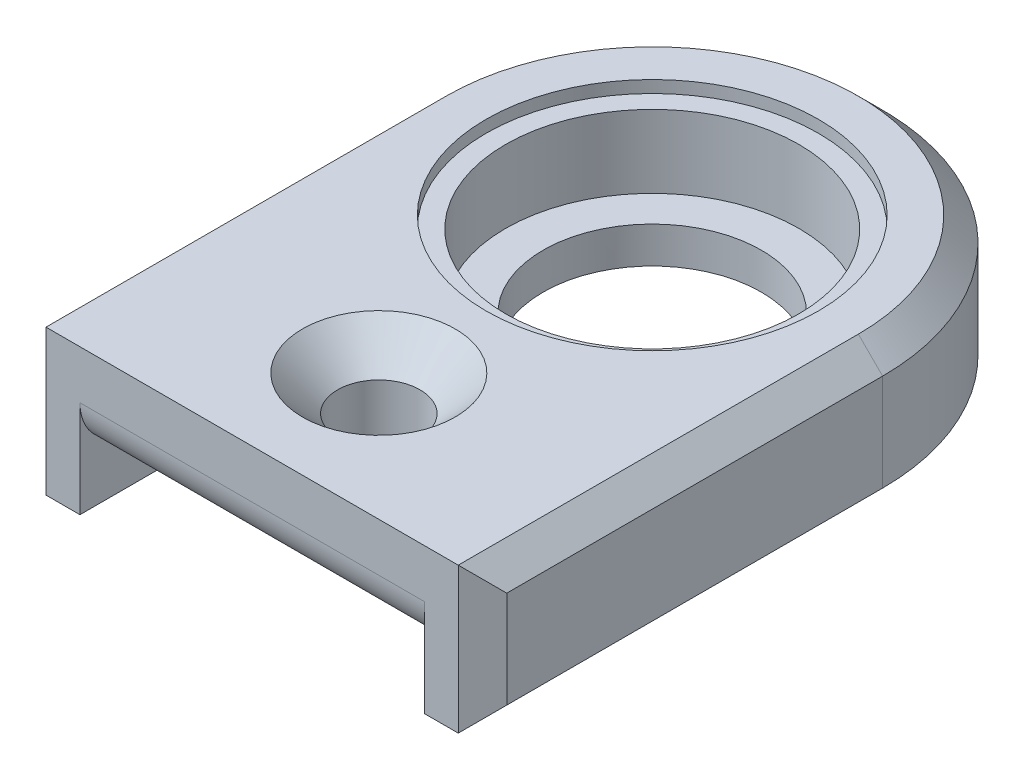
ISO-10303-21;
HEADER;
FILE_DESCRIPTION(('STEP AP214'),'2;1');
FILE_NAME('part.step','',(''),(''),'','','');
FILE_SCHEMA(('AUTOMOTIVE_DESIGN { 1 0 10303 214 1 1 1 1 }'));
ENDSEC;
DATA;
#1=APPLICATION_CONTEXT('core data for automotive mechanical design processes');
#2=APPLICATION_PROTOCOL_DEFINITION('international standard','automotive_design',2000,#1);
#3=PRODUCT_CONTEXT('',#1,'mechanical');
#4=PRODUCT('Part','Part','',(#3));
#5=PRODUCT_RELATED_PRODUCT_CATEGORY('part','',(#4));
#6=PRODUCT_DEFINITION_FORMATION('','',#4);
#7=PRODUCT_DEFINITION_CONTEXT('part definition',#1,'design');
#8=PRODUCT_DEFINITION('design','',#6,#7);
#9=PRODUCT_DEFINITION_SHAPE('','',#8);
#10=(LENGTH_UNIT() NAMED_UNIT(*) SI_UNIT(.MILLI.,.METRE.));
#11=(NAMED_UNIT(*) PLANE_ANGLE_UNIT() SI_UNIT($,.RADIAN.));
#12=(NAMED_UNIT(*) SI_UNIT($,.STERADIAN.) SOLID_ANGLE_UNIT());
#13=UNCERTAINTY_MEASURE_WITH_UNIT(LENGTH_MEASURE(1.E-05),#10,'distance_accuracy_value','');
#14=(GEOMETRIC_REPRESENTATION_CONTEXT(3) GLOBAL_UNCERTAINTY_ASSIGNED_CONTEXT((#13)) GLOBAL_UNIT_ASSIGNED_CONTEXT((#10,
#11,#12)) REPRESENTATION_CONTEXT('',''));
#15=CARTESIAN_POINT('',(0.,0.,0.));
#16=DIRECTION('',(0.,0.,1.));
#17=DIRECTION('',(1.,0.,0.));
#18=AXIS2_PLACEMENT_3D('',#15,#16,#17);
#19=CARTESIAN_POINT('',(0.,6.,0.));
#20=DIRECTION('',(0.,-1.,0.));
#21=DIRECTION('',(0.,0.,-1.));
#22=AXIS2_PLACEMENT_3D('',#19,#20,#21);
#23=PLANE('',#22);
#24=CARTESIAN_POINT('',(0.,6.,0.));
#25=DIRECTION('',(0.,1.,0.));
#26=DIRECTION('',(0.,0.,1.));
#27=AXIS2_PLACEMENT_3D('',#24,#25,#26);
#28=CIRCLE('',#27,6.85);
#29=CARTESIAN_POINT('',(0.,6.,6.85));
#30=VERTEX_POINT('',#29);
#31=EDGE_CURVE('E265',#30,#30,#28,.T.);
#32=ORIENTED_EDGE('',*,*,#31,.F.);
#33=EDGE_LOOP('',(#32));
#34=FACE_BOUND('',#33,.T.);
#35=DIRECTION('',(1.,0.,0.));
#36=VECTOR('',#35,1.);
#37=CARTESIAN_POINT('',(9.5,6.,16.5));
#38=LINE('',#37,#36);
#39=CARTESIAN_POINT('',(-8.49999999999995,6.,16.5));
#40=VERTEX_POINT('',#39);
#41=CARTESIAN_POINT('',(8.49999999999995,6.,16.5));
#42=VERTEX_POINT('',#41);
#43=EDGE_CURVE('E165',#40,#42,#38,.T.);
#44=ORIENTED_EDGE('',*,*,#43,.T.);
#45=DIRECTION('',(0.,0.,-1.));
#46=VECTOR('',#45,1.);
#47=CARTESIAN_POINT('',(8.49999999999995,6.,0.));
#48=LINE('',#47,#46);
#49=CARTESIAN_POINT('',(8.49999999999995,6.,0.));
#50=VERTEX_POINT('',#49);
#51=EDGE_CURVE('E211',#42,#50,#48,.T.);
#52=ORIENTED_EDGE('',*,*,#51,.T.);
#53=CARTESIAN_POINT('',(0.,6.,0.));
#54=DIRECTION('',(0.,-1.,0.));
#55=DIRECTION('',(0.,0.,-1.));
#56=AXIS2_PLACEMENT_3D('',#53,#54,#55);
#57=CIRCLE('',#56,8.49999999999995);
#58=CARTESIAN_POINT('',(-8.49999999999995,6.,0.));
#59=VERTEX_POINT('',#58);
#60=EDGE_CURVE('E209',#50,#59,#57,.F.);
#61=ORIENTED_EDGE('',*,*,#60,.T.);
#62=DIRECTION('',(0.,0.,1.));
#63=VECTOR('',#62,1.);
#64=CARTESIAN_POINT('',(-8.49999999999995,6.,0.));
#65=LINE('',#64,#63);
#66=EDGE_CURVE('E207',#59,#40,#65,.T.);
#67=ORIENTED_EDGE('',*,*,#66,.T.);
#68=EDGE_LOOP('',(#44,#52,#61,#67));
#69=FACE_BOUND('',#68,.T.);
#70=CARTESIAN_POINT('',(0.,6.,11.275));
#71=DIRECTION('',(0.,1.,0.));
#72=DIRECTION('',(0.,0.,1.));
#73=AXIS2_PLACEMENT_3D('',#70,#71,#72);
#74=CIRCLE('',#73,3.15);
#75=CARTESIAN_POINT('',(0.,6.,14.425));
#76=VERTEX_POINT('',#75);
#77=EDGE_CURVE('E241',#76,#76,#74,.T.);
#78=ORIENTED_EDGE('',*,*,#77,.F.);
#79=EDGE_LOOP('',(#78));
#80=FACE_BOUND('',#79,.T.);
#81=ADVANCED_FACE('F34',(#34,#69,#80),#23,.F.);
#82=CARTESIAN_POINT('',(0.,2.,0.));
#83=DIRECTION('',(0.,1.,0.));
#84=DIRECTION('',(0.,0.,1.));
#85=AXIS2_PLACEMENT_3D('',#82,#83,#84);
#86=PLANE('',#85);
#87=CARTESIAN_POINT('',(0.,2.,11.275));
#88=DIRECTION('',(0.,1.,0.));
#89=DIRECTION('',(0.,0.,1.));
#90=AXIS2_PLACEMENT_3D('',#87,#88,#89);
#91=CIRCLE('',#90,1.7);
#92=CARTESIAN_POINT('',(0.,2.,12.975));
#93=VERTEX_POINT('',#92);
#94=EDGE_CURVE('E251',#93,#93,#91,.T.);
#95=ORIENTED_EDGE('',*,*,#94,.T.);
#96=EDGE_LOOP('',(#95));
#97=FACE_BOUND('',#96,.T.);
#98=DIRECTION('',(0.,0.,-1.));
#99=VECTOR('',#98,1.);
#100=CARTESIAN_POINT('',(7.1,2.,16.5));
#101=LINE('',#100,#99);
#102=CARTESIAN_POINT('',(7.1,2.,14.5));
#103=VERTEX_POINT('',#102);
#104=CARTESIAN_POINT('',(7.1,2.,0.));
#105=VERTEX_POINT('',#104);
#106=EDGE_CURVE('E139',#103,#105,#101,.T.);
#107=ORIENTED_EDGE('',*,*,#106,.F.);
#108=DIRECTION('',(1.,0.,0.));
#109=VECTOR('',#108,1.);
#110=CARTESIAN_POINT('',(0.,2.,14.5));
#111=LINE('',#110,#109);
#112=CARTESIAN_POINT('',(-7.1,2.,14.5));
#113=VERTEX_POINT('',#112);
#114=EDGE_CURVE('E134',#103,#113,#111,.F.);
#115=ORIENTED_EDGE('',*,*,#114,.T.);
#116=DIRECTION('',(0.,0.,1.));
#117=VECTOR('',#116,1.);
#118=CARTESIAN_POINT('',(-7.1,2.,0.));
#119=LINE('',#118,#117);
#120=CARTESIAN_POINT('',(-7.1,2.,0.));
#121=VERTEX_POINT('',#120);
#122=EDGE_CURVE('E127',#121,#113,#119,.T.);
#123=ORIENTED_EDGE('',*,*,#122,.F.);
#124=CARTESIAN_POINT('',(0.,2.,0.));
#125=DIRECTION('',(0.,1.,0.));
#126=DIRECTION('',(0.,0.,1.));
#127=AXIS2_PLACEMENT_3D('',#124,#125,#126);
#128=CIRCLE('',#127,7.1);
#129=EDGE_CURVE('E132',#105,#121,#128,.T.);
#130=ORIENTED_EDGE('',*,*,#129,.F.);
#131=EDGE_LOOP('',(#107,#115,#123,#130));
#132=FACE_BOUND('',#131,.T.);
#133=CARTESIAN_POINT('',(0.,2.,0.));
#134=DIRECTION('',(0.,1.,0.));
#135=DIRECTION('',(0.,0.,1.));
#136=AXIS2_PLACEMENT_3D('',#133,#134,#135);
#137=CIRCLE('',#136,5.);
#138=CARTESIAN_POINT('',(0.,2.,5.));
#139=VERTEX_POINT('',#138);
#140=EDGE_CURVE('E186',#139,#139,#137,.F.);
#141=ORIENTED_EDGE('',*,*,#140,.F.);
#142=EDGE_LOOP('',(#141));
#143=FACE_BOUND('',#142,.T.);
#144=ADVANCED_FACE('F130',(#97,#132,#143),#86,.F.);
#145=CARTESIAN_POINT('',(9.5,6.,16.5));
#146=DIRECTION('',(0.,0.,-1.));
#147=DIRECTION('',(-1.,0.,0.));
#148=AXIS2_PLACEMENT_3D('',#145,#146,#147);
#149=PLANE('',#148);
#150=DIRECTION('',(1.,0.,0.));
#151=VECTOR('',#150,1.);
#152=CARTESIAN_POINT('',(9.5,0.,16.5));
#153=LINE('',#152,#151);
#154=CARTESIAN_POINT('',(7.1,0.,16.5));
#155=VERTEX_POINT('',#154);
#156=CARTESIAN_POINT('',(8.49999999999995,0.,16.5));
#157=VERTEX_POINT('',#156);
#158=EDGE_CURVE('E155',#155,#157,#153,.T.);
#159=ORIENTED_EDGE('',*,*,#158,.T.);
#160=DIRECTION('',(0.,1.,0.));
#161=VECTOR('',#160,1.);
#162=CARTESIAN_POINT('',(8.49999999999999,6.,16.5));
#163=LINE('',#162,#161);
#164=EDGE_CURVE('E198',#157,#42,#163,.T.);
#165=ORIENTED_EDGE('',*,*,#164,.T.);
#166=ORIENTED_EDGE('',*,*,#43,.F.);
#167=DIRECTION('',(0.,-1.,0.));
#168=VECTOR('',#167,1.);
#169=CARTESIAN_POINT('',(-8.49999999999995,6.,16.5));
#170=LINE('',#169,#168);
#171=CARTESIAN_POINT('',(-8.49999999999995,0.,16.5));
#172=VERTEX_POINT('',#171);
#173=EDGE_CURVE('E196',#40,#172,#170,.T.);
#174=ORIENTED_EDGE('',*,*,#173,.T.);
#175=CARTESIAN_POINT('',(-7.1,0.,16.5));
#176=VERTEX_POINT('',#175);
#177=EDGE_CURVE('E159',#172,#176,#153,.T.);
#178=ORIENTED_EDGE('',*,*,#177,.T.);
#179=DIRECTION('',(0.,-1.,0.));
#180=VECTOR('',#179,1.);
#181=CARTESIAN_POINT('',(-7.1,2.,16.5));
#182=LINE('',#181,#180);
#183=CARTESIAN_POINT('',(-7.1,4.,16.5));
#184=VERTEX_POINT('',#183);
#185=EDGE_CURVE('E156',#184,#176,#182,.T.);
#186=ORIENTED_EDGE('',*,*,#185,.F.);
#187=DIRECTION('',(1.,0.,0.));
#188=VECTOR('',#187,1.);
#189=CARTESIAN_POINT('',(9.5,4.,16.5));
#190=LINE('',#189,#188);
#191=CARTESIAN_POINT('',(7.1,4.,16.5));
#192=VERTEX_POINT('',#191);
#193=EDGE_CURVE('E173',#184,#192,#190,.T.);
#194=ORIENTED_EDGE('',*,*,#193,.T.);
#195=DIRECTION('',(0.,-1.,0.));
#196=VECTOR('',#195,1.);
#197=CARTESIAN_POINT('',(7.1,2.,16.5));
#198=LINE('',#197,#196);
#199=EDGE_CURVE('E161',#192,#155,#198,.T.);
#200=ORIENTED_EDGE('',*,*,#199,.T.);
#201=EDGE_LOOP('',(#159,#165,#166,#174,#178,#186,#194,#200));
#202=FACE_BOUND('',#201,.T.);
#203=ADVANCED_FACE('F281',(#202),#149,.F.);
#204=CARTESIAN_POINT('',(0.,0.,0.));
#205=DIRECTION('',(0.,-1.,0.));
#206=DIRECTION('',(0.,0.,-1.));
#207=AXIS2_PLACEMENT_3D('',#204,#205,#206);
#208=PLANE('',#207);
#209=CARTESIAN_POINT('',(0.,0.,0.));
#210=DIRECTION('',(0.,-1.,0.));
#211=DIRECTION('',(0.,0.,-1.));
#212=AXIS2_PLACEMENT_3D('',#209,#210,#211);
#213=CIRCLE('',#212,8.49999999999995);
#214=CARTESIAN_POINT('',(-8.49999999999995,0.,0.));
#215=VERTEX_POINT('',#214);
#216=CARTESIAN_POINT('',(8.49999999999995,0.,0.));
#217=VERTEX_POINT('',#216);
#218=EDGE_CURVE('E203',#215,#217,#213,.T.);
#219=ORIENTED_EDGE('',*,*,#218,.T.);
#220=DIRECTION('',(0.,0.,1.));
#221=VECTOR('',#220,1.);
#222=CARTESIAN_POINT('',(8.49999999999995,0.,16.5));
#223=LINE('',#222,#221);
#224=EDGE_CURVE('E205',#217,#157,#223,.T.);
#225=ORIENTED_EDGE('',*,*,#224,.T.);
#226=ORIENTED_EDGE('',*,*,#158,.F.);
#227=DIRECTION('',(0.,0.,-1.));
#228=VECTOR('',#227,1.);
#229=CARTESIAN_POINT('',(7.1,0.,16.5));
#230=LINE('',#229,#228);
#231=CARTESIAN_POINT('',(7.1,0.,0.));
#232=VERTEX_POINT('',#231);
#233=EDGE_CURVE('E149',#155,#232,#230,.T.);
#234=ORIENTED_EDGE('',*,*,#233,.T.);
#235=CARTESIAN_POINT('',(0.,0.,0.));
#236=DIRECTION('',(0.,1.,0.));
#237=DIRECTION('',(0.,0.,1.));
#238=AXIS2_PLACEMENT_3D('',#235,#236,#237);
#239=CIRCLE('',#238,7.1);
#240=CARTESIAN_POINT('',(-7.1,0.,0.));
#241=VERTEX_POINT('',#240);
#242=EDGE_CURVE('E271',#232,#241,#239,.T.);
#243=ORIENTED_EDGE('',*,*,#242,.T.);
#244=DIRECTION('',(0.,0.,1.));
#245=VECTOR('',#244,1.);
#246=CARTESIAN_POINT('',(-7.1,0.,0.));
#247=LINE('',#246,#245);
#248=EDGE_CURVE('E154',#241,#176,#247,.T.);
#249=ORIENTED_EDGE('',*,*,#248,.T.);
#250=ORIENTED_EDGE('',*,*,#177,.F.);
#251=DIRECTION('',(0.,0.,-1.));
#252=VECTOR('',#251,1.);
#253=CARTESIAN_POINT('',(-8.49999999999995,0.,0.));
#254=LINE('',#253,#252);
#255=EDGE_CURVE('E201',#172,#215,#254,.T.);
#256=ORIENTED_EDGE('',*,*,#255,.T.);
#257=EDGE_LOOP('',(#219,#225,#226,#234,#243,#249,#250,#256));
#258=FACE_BOUND('',#257,.T.);
#259=ADVANCED_FACE('F287',(#258),#208,.T.);
#260=CARTESIAN_POINT('',(0.,6.,0.));
#261=DIRECTION('',(0.,-1.,0.));
#262=DIRECTION('',(0.,0.,-1.));
#263=AXIS2_PLACEMENT_3D('',#260,#261,#262);
#264=CYLINDRICAL_SURFACE('',#263,9.5);
#265=DIRECTION('',(0.,-1.,0.));
#266=VECTOR('',#265,1.);
#267=CARTESIAN_POINT('',(9.5,6.,0.));
#268=LINE('',#267,#266);
#269=CARTESIAN_POINT('',(9.5,5.,0.));
#270=VERTEX_POINT('',#269);
#271=CARTESIAN_POINT('',(9.5,1.,0.));
#272=VERTEX_POINT('',#271);
#273=EDGE_CURVE('E167',#270,#272,#268,.T.);
#274=ORIENTED_EDGE('',*,*,#273,.T.);
#275=CARTESIAN_POINT('',(0.,1.,0.));
#276=DIRECTION('',(0.,-1.,0.));
#277=DIRECTION('',(0.,0.,-1.));
#278=AXIS2_PLACEMENT_3D('',#275,#276,#277);
#279=CIRCLE('',#278,9.5);
#280=CARTESIAN_POINT('',(-9.5,1.,0.));
#281=VERTEX_POINT('',#280);
#282=EDGE_CURVE('E215',#272,#281,#279,.F.);
#283=ORIENTED_EDGE('',*,*,#282,.T.);
#284=DIRECTION('',(0.,-1.,0.));
#285=VECTOR('',#284,1.);
#286=CARTESIAN_POINT('',(-9.5,6.,0.));
#287=LINE('',#286,#285);
#288=CARTESIAN_POINT('',(-9.5,5.,0.));
#289=VERTEX_POINT('',#288);
#290=EDGE_CURVE('E171',#289,#281,#287,.T.);
#291=ORIENTED_EDGE('',*,*,#290,.F.);
#292=CARTESIAN_POINT('',(0.,5.,0.));
#293=DIRECTION('',(0.,-1.,0.));
#294=DIRECTION('',(0.,0.,-1.));
#295=AXIS2_PLACEMENT_3D('',#292,#293,#294);
#296=CIRCLE('',#295,9.5);
#297=EDGE_CURVE('E213',#289,#270,#296,.T.);
#298=ORIENTED_EDGE('',*,*,#297,.T.);
#299=EDGE_LOOP('',(#274,#283,#291,#298));
#300=FACE_BOUND('',#299,.T.);
#301=ADVANCED_FACE('F315',(#300),#264,.T.);
#302=CARTESIAN_POINT('',(-9.5,6.,16.5));
#303=DIRECTION('',(1.,0.,0.));
#304=DIRECTION('',(0.,0.,-1.));
#305=AXIS2_PLACEMENT_3D('',#302,#303,#304);
#306=PLANE('',#305);
#307=ORIENTED_EDGE('',*,*,#290,.T.);
#308=DIRECTION('',(0.,0.,1.));
#309=VECTOR('',#308,1.);
#310=CARTESIAN_POINT('',(-9.5,1.,16.5));
#311=LINE('',#310,#309);
#312=CARTESIAN_POINT('',(-9.5,1.,15.5));
#313=VERTEX_POINT('',#312);
#314=EDGE_CURVE('E11',#281,#313,#311,.T.);
#315=ORIENTED_EDGE('',*,*,#314,.T.);
#316=DIRECTION('',(0.,1.,0.));
#317=VECTOR('',#316,1.);
#318=CARTESIAN_POINT('',(-9.5,6.,15.5));
#319=LINE('',#318,#317);
#320=CARTESIAN_POINT('',(-9.5,5.,15.5));
#321=VERTEX_POINT('',#320);
#322=EDGE_CURVE('E43',#313,#321,#319,.T.);
#323=ORIENTED_EDGE('',*,*,#322,.T.);
#324=DIRECTION('',(0.,0.,-1.));
#325=VECTOR('',#324,1.);
#326=CARTESIAN_POINT('',(-9.5,5.,16.5));
#327=LINE('',#326,#325);
#328=EDGE_CURVE('E217',#321,#289,#327,.T.);
#329=ORIENTED_EDGE('',*,*,#328,.T.);
#330=EDGE_LOOP('',(#307,#315,#323,#329));
#331=FACE_BOUND('',#330,.T.);
#332=ADVANCED_FACE('F347',(#331),#306,.F.);
#333=CARTESIAN_POINT('',(9.5,6.,0.));
#334=DIRECTION('',(-1.,0.,0.));
#335=DIRECTION('',(0.,0.,1.));
#336=AXIS2_PLACEMENT_3D('',#333,#334,#335);
#337=PLANE('',#336);
#338=DIRECTION('',(0.,-1.,0.));
#339=VECTOR('',#338,1.);
#340=CARTESIAN_POINT('',(9.5,6.,15.5));
#341=LINE('',#340,#339);
#342=CARTESIAN_POINT('',(9.5,5.,15.5));
#343=VERTEX_POINT('',#342);
#344=CARTESIAN_POINT('',(9.5,1.,15.5));
#345=VERTEX_POINT('',#344);
#346=EDGE_CURVE('E191',#343,#345,#341,.T.);
#347=ORIENTED_EDGE('',*,*,#346,.T.);
#348=DIRECTION('',(0.,0.,-1.));
#349=VECTOR('',#348,1.);
#350=CARTESIAN_POINT('',(9.5,1.,0.));
#351=LINE('',#350,#349);
#352=EDGE_CURVE('E194',#345,#272,#351,.T.);
#353=ORIENTED_EDGE('',*,*,#352,.T.);
#354=ORIENTED_EDGE('',*,*,#273,.F.);
#355=DIRECTION('',(0.,0.,1.));
#356=VECTOR('',#355,1.);
#357=CARTESIAN_POINT('',(9.5,5.,0.));
#358=LINE('',#357,#356);
#359=EDGE_CURVE('E189',#270,#343,#358,.T.);
#360=ORIENTED_EDGE('',*,*,#359,.T.);
#361=EDGE_LOOP('',(#347,#353,#354,#360));
#362=FACE_BOUND('',#361,.T.);
#363=ADVANCED_FACE('F318',(#362),#337,.F.);
#364=CARTESIAN_POINT('',(0.,2.,0.));
#365=DIRECTION('',(0.,-1.,0.));
#366=DIRECTION('',(0.,0.,-1.));
#367=AXIS2_PLACEMENT_3D('',#364,#365,#366);
#368=CYLINDRICAL_SURFACE('',#367,7.1);
#369=ORIENTED_EDGE('',*,*,#242,.F.);
#370=DIRECTION('',(0.,-1.,0.));
#371=VECTOR('',#370,1.);
#372=CARTESIAN_POINT('',(7.1,2.,0.));
#373=LINE('',#372,#371);
#374=EDGE_CURVE('E148',#105,#232,#373,.T.);
#375=ORIENTED_EDGE('',*,*,#374,.F.);
#376=ORIENTED_EDGE('',*,*,#129,.T.);
#377=DIRECTION('',(0.,-1.,0.));
#378=VECTOR('',#377,1.);
#379=CARTESIAN_POINT('',(-7.1,2.,0.));
#380=LINE('',#379,#378);
#381=EDGE_CURVE('E145',#121,#241,#380,.T.);
#382=ORIENTED_EDGE('',*,*,#381,.T.);
#383=EDGE_LOOP('',(#369,#375,#376,#382));
#384=FACE_BOUND('',#383,.T.);
#385=ADVANCED_FACE('F144',(#384),#368,.F.);
#386=CARTESIAN_POINT('',(-7.1,2.,0.));
#387=DIRECTION('',(1.,0.,0.));
#388=DIRECTION('',(0.,0.,-1.));
#389=AXIS2_PLACEMENT_3D('',#386,#387,#388);
#390=PLANE('',#389);
#391=ORIENTED_EDGE('',*,*,#248,.F.);
#392=ORIENTED_EDGE('',*,*,#381,.F.);
#393=ORIENTED_EDGE('',*,*,#122,.T.);
#394=CARTESIAN_POINT('',(-7.1,4.,14.5));
#395=DIRECTION('',(1.,0.,0.));
#396=DIRECTION('',(0.,0.,-1.));
#397=AXIS2_PLACEMENT_3D('',#394,#395,#396);
#398=CIRCLE('',#397,2.);
#399=EDGE_CURVE('E184',#113,#184,#398,.F.);
#400=ORIENTED_EDGE('',*,*,#399,.T.);
#401=ORIENTED_EDGE('',*,*,#185,.T.);
#402=EDGE_LOOP('',(#391,#392,#393,#400,#401));
#403=FACE_BOUND('',#402,.T.);
#404=ADVANCED_FACE('F151',(#403),#390,.T.);
#405=CARTESIAN_POINT('',(7.1,2.,16.5));
#406=DIRECTION('',(-1.,0.,0.));
#407=DIRECTION('',(0.,0.,1.));
#408=AXIS2_PLACEMENT_3D('',#405,#406,#407);
#409=PLANE('',#408);
#410=ORIENTED_EDGE('',*,*,#233,.F.);
#411=ORIENTED_EDGE('',*,*,#199,.F.);
#412=CARTESIAN_POINT('',(7.1,4.,14.5));
#413=DIRECTION('',(-1.,0.,0.));
#414=DIRECTION('',(0.,0.,1.));
#415=AXIS2_PLACEMENT_3D('',#412,#413,#414);
#416=CIRCLE('',#415,2.);
#417=EDGE_CURVE('E182',#192,#103,#416,.F.);
#418=ORIENTED_EDGE('',*,*,#417,.T.);
#419=ORIENTED_EDGE('',*,*,#106,.T.);
#420=ORIENTED_EDGE('',*,*,#374,.T.);
#421=EDGE_LOOP('',(#410,#411,#418,#419,#420));
#422=FACE_BOUND('',#421,.T.);
#423=ADVANCED_FACE('F513',(#422),#409,.T.);
#424=CARTESIAN_POINT('',(0.,5.5,0.));
#425=DIRECTION('',(0.,1.,0.));
#426=DIRECTION('',(0.,0.,1.));
#427=AXIS2_PLACEMENT_3D('',#424,#425,#426);
#428=PLANE('',#427);
#429=CARTESIAN_POINT('',(0.,5.5,0.));
#430=DIRECTION('',(0.,1.,0.));
#431=DIRECTION('',(0.,0.,1.));
#432=AXIS2_PLACEMENT_3D('',#429,#430,#431);
#433=CIRCLE('',#432,6.85);
#434=CARTESIAN_POINT('',(0.,5.5,6.85));
#435=VERTEX_POINT('',#434);
#436=EDGE_CURVE('E178',#435,#435,#433,.T.);
#437=ORIENTED_EDGE('',*,*,#436,.T.);
#438=EDGE_LOOP('',(#437));
#439=FACE_BOUND('',#438,.T.);
#440=CARTESIAN_POINT('',(0.,5.5,0.));
#441=DIRECTION('',(0.,1.,0.));
#442=DIRECTION('',(0.,0.,1.));
#443=AXIS2_PLACEMENT_3D('',#440,#441,#442);
#444=CIRCLE('',#443,6.05);
#445=CARTESIAN_POINT('',(0.,5.5,6.05));
#446=VERTEX_POINT('',#445);
#447=EDGE_CURVE('E174',#446,#446,#444,.F.);
#448=ORIENTED_EDGE('',*,*,#447,.T.);
#449=EDGE_LOOP('',(#448));
#450=FACE_BOUND('',#449,.T.);
#451=ADVANCED_FACE('F518',(#439,#450),#428,.T.);
#452=CARTESIAN_POINT('',(0.,5.5,0.));
#453=DIRECTION('',(0.,1.,0.));
#454=DIRECTION('',(0.,0.,1.));
#455=AXIS2_PLACEMENT_3D('',#452,#453,#454);
#456=CYLINDRICAL_SURFACE('',#455,6.85);
#457=ORIENTED_EDGE('',*,*,#436,.F.);
#458=EDGE_LOOP('',(#457));
#459=FACE_BOUND('',#458,.T.);
#460=ORIENTED_EDGE('',*,*,#31,.T.);
#461=EDGE_LOOP('',(#460));
#462=FACE_BOUND('',#461,.T.);
#463=ADVANCED_FACE('F536',(#459,#462),#456,.F.);
#464=CARTESIAN_POINT('',(0.,2.5,0.));
#465=DIRECTION('',(0.,1.,0.));
#466=DIRECTION('',(0.,0.,1.));
#467=AXIS2_PLACEMENT_3D('',#464,#465,#466);
#468=PLANE('',#467);
#469=CARTESIAN_POINT('',(0.,2.5,0.));
#470=DIRECTION('',(0.,1.,0.));
#471=DIRECTION('',(0.,0.,1.));
#472=AXIS2_PLACEMENT_3D('',#469,#470,#471);
#473=CIRCLE('',#472,4.5);
#474=CARTESIAN_POINT('',(0.,2.5,4.5));
#475=VERTEX_POINT('',#474);
#476=EDGE_CURVE('E262',#475,#475,#473,.T.);
#477=ORIENTED_EDGE('',*,*,#476,.F.);
#478=EDGE_LOOP('',(#477));
#479=FACE_BOUND('',#478,.T.);
#480=CARTESIAN_POINT('',(0.,2.5,0.));
#481=DIRECTION('',(0.,1.,0.));
#482=DIRECTION('',(0.,0.,1.));
#483=AXIS2_PLACEMENT_3D('',#480,#481,#482);
#484=CIRCLE('',#483,6.05);
#485=CARTESIAN_POINT('',(0.,2.5,6.05));
#486=VERTEX_POINT('',#485);
#487=EDGE_CURVE('E177',#486,#486,#484,.T.);
#488=ORIENTED_EDGE('',*,*,#487,.T.);
#489=EDGE_LOOP('',(#488));
#490=FACE_BOUND('',#489,.T.);
#491=ADVANCED_FACE('F532',(#479,#490),#468,.T.);
#492=CARTESIAN_POINT('',(0.,2.5,0.));
#493=DIRECTION('',(0.,1.,0.));
#494=DIRECTION('',(0.,0.,1.));
#495=AXIS2_PLACEMENT_3D('',#492,#493,#494);
#496=CYLINDRICAL_SURFACE('',#495,6.05);
#497=ORIENTED_EDGE('',*,*,#487,.F.);
#498=EDGE_LOOP('',(#497));
#499=FACE_BOUND('',#498,.T.);
#500=ORIENTED_EDGE('',*,*,#447,.F.);
#501=EDGE_LOOP('',(#500));
#502=FACE_BOUND('',#501,.T.);
#503=ADVANCED_FACE('F500',(#499,#502),#496,.F.);
#504=CARTESIAN_POINT('',(0.,-0.00100000000000013,0.));
#505=DIRECTION('',(0.,1.,0.));
#506=DIRECTION('',(0.,0.,1.));
#507=AXIS2_PLACEMENT_3D('',#504,#505,#506);
#508=CYLINDRICAL_SURFACE('',#507,4.5);
#509=ORIENTED_EDGE('',*,*,#476,.T.);
#510=EDGE_LOOP('',(#509));
#511=FACE_BOUND('',#510,.T.);
#512=CARTESIAN_POINT('',(0.,1.,0.));
#513=DIRECTION('',(0.,-1.,0.));
#514=DIRECTION('',(0.,0.,-1.));
#515=AXIS2_PLACEMENT_3D('',#512,#513,#514);
#516=CIRCLE('',#515,4.5);
#517=CARTESIAN_POINT('',(0.,1.,-4.5));
#518=VERTEX_POINT('',#517);
#519=EDGE_CURVE('E256',#518,#518,#516,.T.);
#520=ORIENTED_EDGE('',*,*,#519,.T.);
#521=EDGE_LOOP('',(#520));
#522=FACE_BOUND('',#521,.T.);
#523=ADVANCED_FACE('F358',(#511,#522),#508,.F.);
#524=CARTESIAN_POINT('',(9.5,4.,14.5));
#525=DIRECTION('',(1.,0.,0.));
#526=DIRECTION('',(0.,0.,-1.));
#527=AXIS2_PLACEMENT_3D('',#524,#525,#526);
#528=CYLINDRICAL_SURFACE('',#527,2.);
#529=ORIENTED_EDGE('',*,*,#399,.F.);
#530=ORIENTED_EDGE('',*,*,#114,.F.);
#531=ORIENTED_EDGE('',*,*,#417,.F.);
#532=ORIENTED_EDGE('',*,*,#193,.F.);
#533=EDGE_LOOP('',(#529,#530,#531,#532));
#534=FACE_BOUND('',#533,.T.);
#535=ADVANCED_FACE('F354',(#534),#528,.T.);
#536=CARTESIAN_POINT('',(0.,1.,0.));
#537=DIRECTION('',(0.,-1.,0.));
#538=DIRECTION('',(0.,0.,-1.));
#539=AXIS2_PLACEMENT_3D('',#536,#537,#538);
#540=PLANE('',#539);
#541=CARTESIAN_POINT('',(0.,1.,0.));
#542=DIRECTION('',(0.,-1.,0.));
#543=DIRECTION('',(0.,0.,-1.));
#544=AXIS2_PLACEMENT_3D('',#541,#542,#543);
#545=CIRCLE('',#544,5.);
#546=CARTESIAN_POINT('',(0.,1.,-5.));
#547=VERTEX_POINT('',#546);
#548=EDGE_CURVE('E259',#547,#547,#545,.T.);
#549=ORIENTED_EDGE('',*,*,#548,.T.);
#550=EDGE_LOOP('',(#549));
#551=FACE_BOUND('',#550,.T.);
#552=ORIENTED_EDGE('',*,*,#519,.F.);
#553=EDGE_LOOP('',(#552));
#554=FACE_BOUND('',#553,.T.);
#555=ADVANCED_FACE('F357',(#551,#554),#540,.T.);
#556=CARTESIAN_POINT('',(0.,1.,0.));
#557=DIRECTION('',(0.,1.,0.));
#558=DIRECTION('',(0.,0.,1.));
#559=AXIS2_PLACEMENT_3D('',#556,#557,#558);
#560=CYLINDRICAL_SURFACE('',#559,5.);
#561=ORIENTED_EDGE('',*,*,#548,.F.);
#562=EDGE_LOOP('',(#561));
#563=FACE_BOUND('',#562,.T.);
#564=ORIENTED_EDGE('',*,*,#140,.T.);
#565=EDGE_LOOP('',(#564));
#566=FACE_BOUND('',#565,.T.);
#567=ADVANCED_FACE('F466',(#563,#566),#560,.T.);
#568=CARTESIAN_POINT('',(0.,6.,11.275));
#569=DIRECTION('',(0.,1.,0.));
#570=DIRECTION('',(0.,0.,1.));
#571=AXIS2_PLACEMENT_3D('',#568,#569,#570);
#572=CYLINDRICAL_SURFACE('',#571,1.7);
#573=ORIENTED_EDGE('',*,*,#94,.F.);
#574=EDGE_LOOP('',(#573));
#575=FACE_BOUND('',#574,.T.);
#576=CARTESIAN_POINT('',(0.,4.55,11.275));
#577=DIRECTION('',(0.,1.,0.));
#578=DIRECTION('',(0.,0.,1.));
#579=AXIS2_PLACEMENT_3D('',#576,#577,#578);
#580=CIRCLE('',#579,1.7);
#581=CARTESIAN_POINT('',(0.,4.55,12.975));
#582=VERTEX_POINT('',#581);
#583=EDGE_CURVE('E246',#582,#582,#580,.T.);
#584=ORIENTED_EDGE('',*,*,#583,.T.);
#585=EDGE_LOOP('',(#584));
#586=FACE_BOUND('',#585,.T.);
#587=ADVANCED_FACE('F457',(#575,#586),#572,.F.);
#588=CARTESIAN_POINT('',(0.,6.,11.275));
#589=DIRECTION('',(0.,1.,0.));
#590=DIRECTION('',(0.,0.,1.));
#591=AXIS2_PLACEMENT_3D('',#588,#589,#590);
#592=CONICAL_SURFACE('',#591,3.15,0.785398163397449);
#593=ORIENTED_EDGE('',*,*,#583,.F.);
#594=EDGE_LOOP('',(#593));
#595=FACE_BOUND('',#594,.T.);
#596=ORIENTED_EDGE('',*,*,#77,.T.);
#597=EDGE_LOOP('',(#596));
#598=FACE_BOUND('',#597,.T.);
#599=ADVANCED_FACE('F410',(#595,#598),#592,.F.);
#600=CARTESIAN_POINT('',(-8.49999999999995,6.,16.5));
#601=DIRECTION('',(0.70710678118653,0.,-0.707106781186565));
#602=DIRECTION('',(0.,-1.,0.));
#603=AXIS2_PLACEMENT_3D('',#600,#601,#602);
#604=PLANE('',#603);
#605=DIRECTION('',(-0.577350269189644,0.577350269189616,-0.577350269189616));
#606=VECTOR('',#605,1.);
#607=CARTESIAN_POINT('',(-10.5,1.99999999999993,14.5000000000001));
#608=LINE('',#607,#606);
#609=EDGE_CURVE('E235',#172,#313,#608,.T.);
#610=ORIENTED_EDGE('',*,*,#609,.F.);
#611=ORIENTED_EDGE('',*,*,#173,.F.);
#612=DIRECTION('',(0.577350269189644,0.577350269189616,0.577350269189616));
#613=VECTOR('',#612,1.);
#614=CARTESIAN_POINT('',(-14.,0.500000000000177,11.0000000000002));
#615=LINE('',#614,#613);
#616=EDGE_CURVE('E38',#321,#40,#615,.T.);
#617=ORIENTED_EDGE('',*,*,#616,.F.);
#618=ORIENTED_EDGE('',*,*,#322,.F.);
#619=EDGE_LOOP('',(#610,#611,#617,#618));
#620=FACE_BOUND('',#619,.T.);
#621=ADVANCED_FACE('F36',(#620),#604,.F.);
#622=CARTESIAN_POINT('',(-8.49999999999995,6.,0.));
#623=DIRECTION('',(0.70710678118653,-0.707106781186565,0.));
#624=DIRECTION('',(0.,0.,1.));
#625=AXIS2_PLACEMENT_3D('',#622,#623,#624);
#626=PLANE('',#625);
#627=ORIENTED_EDGE('',*,*,#616,.T.);
#628=ORIENTED_EDGE('',*,*,#66,.F.);
#629=DIRECTION('',(0.707106781186565,0.70710678118653,0.));
#630=VECTOR('',#629,1.);
#631=CARTESIAN_POINT('',(-9.5,5.,0.));
#632=LINE('',#631,#630);
#633=EDGE_CURVE('E233',#289,#59,#632,.T.);
#634=ORIENTED_EDGE('',*,*,#633,.F.);
#635=ORIENTED_EDGE('',*,*,#328,.F.);
#636=EDGE_LOOP('',(#627,#628,#634,#635));
#637=FACE_BOUND('',#636,.T.);
#638=ADVANCED_FACE('F306',(#637),#626,.F.);
#639=CARTESIAN_POINT('',(-9.5,1.,16.5));
#640=DIRECTION('',(-0.70710678118653,-0.707106781186565,0.));
#641=DIRECTION('',(0.,0.,-1.));
#642=AXIS2_PLACEMENT_3D('',#639,#640,#641);
#643=PLANE('',#642);
#644=ORIENTED_EDGE('',*,*,#609,.T.);
#645=ORIENTED_EDGE('',*,*,#314,.F.);
#646=DIRECTION('',(-0.707106781186565,0.70710678118653,0.));
#647=VECTOR('',#646,1.);
#648=CARTESIAN_POINT('',(-8.49999999999995,0.,0.));
#649=LINE('',#648,#647);
#650=EDGE_CURVE('E230',#215,#281,#649,.T.);
#651=ORIENTED_EDGE('',*,*,#650,.F.);
#652=ORIENTED_EDGE('',*,*,#255,.F.);
#653=EDGE_LOOP('',(#644,#645,#651,#652));
#654=FACE_BOUND('',#653,.T.);
#655=ADVANCED_FACE('F386',(#654),#643,.T.);
#656=CARTESIAN_POINT('',(0.,6.,0.));
#657=DIRECTION('',(0.,-1.,0.));
#658=DIRECTION('',(0.,0.,-1.));
#659=AXIS2_PLACEMENT_3D('',#656,#657,#658);
#660=CONICAL_SURFACE('',#659,8.49999999999995,0.785398163397473);
#661=ORIENTED_EDGE('',*,*,#633,.T.);
#662=ORIENTED_EDGE('',*,*,#60,.F.);
#663=DIRECTION('',(-0.707106781186565,0.70710678118653,0.));
#664=VECTOR('',#663,1.);
#665=CARTESIAN_POINT('',(9.5,5.,0.));
#666=LINE('',#665,#664);
#667=EDGE_CURVE('E227',#270,#50,#666,.T.);
#668=ORIENTED_EDGE('',*,*,#667,.F.);
#669=ORIENTED_EDGE('',*,*,#297,.F.);
#670=EDGE_LOOP('',(#661,#662,#668,#669));
#671=FACE_BOUND('',#670,.T.);
#672=ADVANCED_FACE('F309',(#671),#660,.T.);
#673=CARTESIAN_POINT('',(0.,1.,0.));
#674=DIRECTION('',(0.,1.,0.));
#675=DIRECTION('',(0.,0.,1.));
#676=AXIS2_PLACEMENT_3D('',#673,#674,#675);
#677=CONICAL_SURFACE('',#676,9.5,0.785398163397473);
#678=ORIENTED_EDGE('',*,*,#650,.T.);
#679=ORIENTED_EDGE('',*,*,#282,.F.);
#680=DIRECTION('',(0.707106781186565,0.70710678118653,0.));
#681=VECTOR('',#680,1.);
#682=CARTESIAN_POINT('',(8.49999999999995,0.,0.));
#683=LINE('',#682,#681);
#684=EDGE_CURVE('E224',#217,#272,#683,.T.);
#685=ORIENTED_EDGE('',*,*,#684,.F.);
#686=ORIENTED_EDGE('',*,*,#218,.F.);
#687=EDGE_LOOP('',(#678,#679,#685,#686));
#688=FACE_BOUND('',#687,.T.);
#689=ADVANCED_FACE('F322',(#688),#677,.T.);
#690=CARTESIAN_POINT('',(8.49999999999995,6.,0.));
#691=DIRECTION('',(-0.70710678118653,-0.707106781186565,0.));
#692=DIRECTION('',(0.,0.,-1.));
#693=AXIS2_PLACEMENT_3D('',#690,#691,#692);
#694=PLANE('',#693);
#695=ORIENTED_EDGE('',*,*,#667,.T.);
#696=ORIENTED_EDGE('',*,*,#51,.F.);
#697=DIRECTION('',(0.577350269189626,-0.577350269189598,-0.577350269189652));
#698=VECTOR('',#697,1.);
#699=CARTESIAN_POINT('',(14.0000000000002,0.499999999999992,10.9999999999995));
#700=LINE('',#699,#698);
#701=EDGE_CURVE('E222',#343,#42,#700,.F.);
#702=ORIENTED_EDGE('',*,*,#701,.F.);
#703=ORIENTED_EDGE('',*,*,#359,.F.);
#704=EDGE_LOOP('',(#695,#696,#702,#703));
#705=FACE_BOUND('',#704,.T.);
#706=ADVANCED_FACE('F320',(#705),#694,.F.);
#707=CARTESIAN_POINT('',(9.5,1.,0.));
#708=DIRECTION('',(0.70710678118653,-0.707106781186565,0.));
#709=DIRECTION('',(0.,0.,1.));
#710=AXIS2_PLACEMENT_3D('',#707,#708,#709);
#711=PLANE('',#710);
#712=ORIENTED_EDGE('',*,*,#684,.T.);
#713=ORIENTED_EDGE('',*,*,#352,.F.);
#714=DIRECTION('',(0.577350269189626,0.577350269189598,-0.577350269189652));
#715=VECTOR('',#714,1.);
#716=CARTESIAN_POINT('',(14.6666666666669,6.16666666666665,10.3333333333328));
#717=LINE('',#716,#715);
#718=EDGE_CURVE('E220',#157,#345,#717,.T.);
#719=ORIENTED_EDGE('',*,*,#718,.F.);
#720=ORIENTED_EDGE('',*,*,#224,.F.);
#721=EDGE_LOOP('',(#712,#713,#719,#720));
#722=FACE_BOUND('',#721,.T.);
#723=ADVANCED_FACE('F293',(#722),#711,.T.);
#724=CARTESIAN_POINT('',(9.5,6.,15.5));
#725=DIRECTION('',(-0.707106781186563,0.,-0.707106781186532));
#726=DIRECTION('',(0.,-1.,0.));
#727=AXIS2_PLACEMENT_3D('',#724,#725,#726);
#728=PLANE('',#727);
#729=ORIENTED_EDGE('',*,*,#701,.T.);
#730=ORIENTED_EDGE('',*,*,#164,.F.);
#731=ORIENTED_EDGE('',*,*,#718,.T.);
#732=ORIENTED_EDGE('',*,*,#346,.F.);
#733=EDGE_LOOP('',(#729,#730,#731,#732));
#734=FACE_BOUND('',#733,.T.);
#735=ADVANCED_FACE('F297',(#734),#728,.F.);
#736=CLOSED_SHELL('',(#81,#144,#203,#259,#301,#332,#363,#385,#404,#423,#451,#463,#491,#503,#523,
#535,#555,#567,#587,#599,#621,#638,#655,#672,#689,#706,#723,#735));
#737=MANIFOLD_SOLID_BREP('B2',#736);
#738=ADVANCED_BREP_SHAPE_REPRESENTATION('',(#18,#737),#14);
#739=SHAPE_DEFINITION_REPRESENTATION(#9,#738);
ENDSEC;
END-ISO-10303-21;
